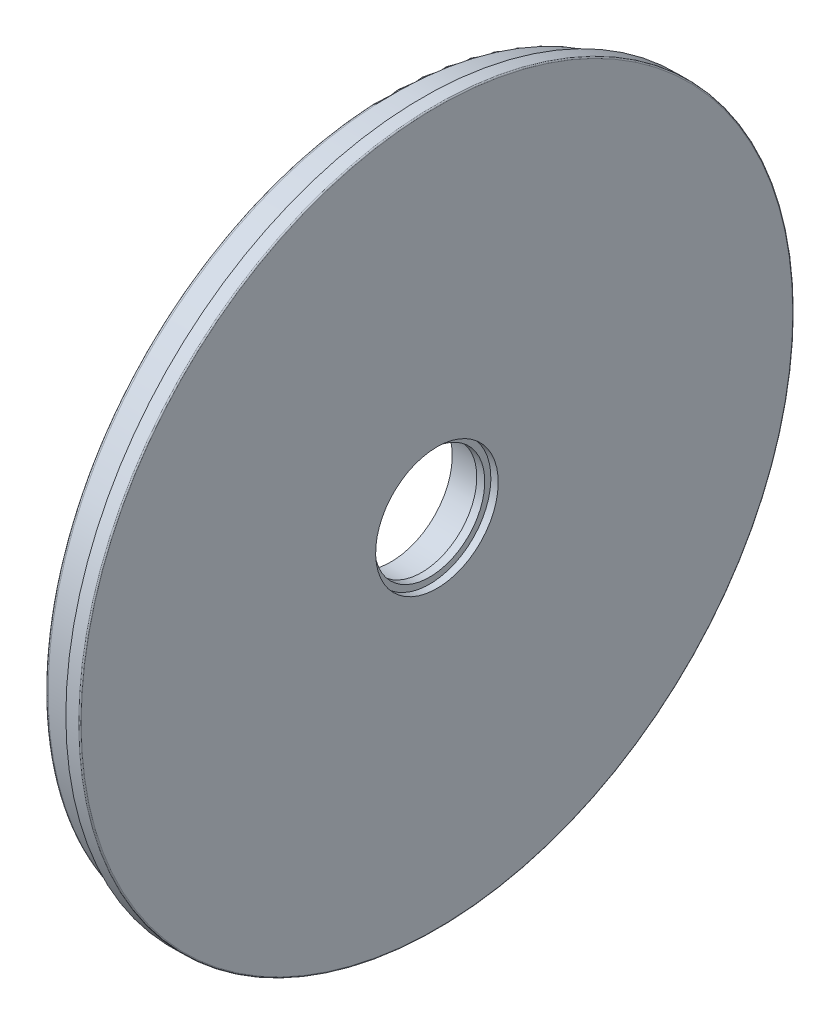
ISO-10303-21;
HEADER;
FILE_DESCRIPTION(('STEP AP214'),'2;1');
FILE_NAME('part.step','',(''),(''),'','','');
FILE_SCHEMA(('AUTOMOTIVE_DESIGN { 1 0 10303 214 1 1 1 1 }'));
ENDSEC;
DATA;
#1=APPLICATION_CONTEXT('core data for automotive mechanical design processes');
#2=APPLICATION_PROTOCOL_DEFINITION('international standard','automotive_design',2000,#1);
#3=PRODUCT_CONTEXT('',#1,'mechanical');
#4=PRODUCT('Part','Part','',(#3));
#5=PRODUCT_RELATED_PRODUCT_CATEGORY('part','',(#4));
#6=PRODUCT_DEFINITION_FORMATION('','',#4);
#7=PRODUCT_DEFINITION_CONTEXT('part definition',#1,'design');
#8=PRODUCT_DEFINITION('design','',#6,#7);
#9=PRODUCT_DEFINITION_SHAPE('','',#8);
#10=(LENGTH_UNIT() NAMED_UNIT(*) SI_UNIT(.MILLI.,.METRE.));
#11=(NAMED_UNIT(*) PLANE_ANGLE_UNIT() SI_UNIT($,.RADIAN.));
#12=(NAMED_UNIT(*) SI_UNIT($,.STERADIAN.) SOLID_ANGLE_UNIT());
#13=UNCERTAINTY_MEASURE_WITH_UNIT(LENGTH_MEASURE(1.E-05),#10,'distance_accuracy_value','');
#14=(GEOMETRIC_REPRESENTATION_CONTEXT(3) GLOBAL_UNCERTAINTY_ASSIGNED_CONTEXT((#13)) GLOBAL_UNIT_ASSIGNED_CONTEXT((#10,
#11,#12)) REPRESENTATION_CONTEXT('',''));
#15=CARTESIAN_POINT('',(0.,0.,0.));
#16=DIRECTION('',(0.,0.,1.));
#17=DIRECTION('',(1.,0.,0.));
#18=AXIS2_PLACEMENT_3D('',#15,#16,#17);
#19=CARTESIAN_POINT('',(167.134413688106,0.,0.));
#20=DIRECTION('',(-1.,0.,0.));
#21=DIRECTION('',(0.,0.,1.));
#22=AXIS2_PLACEMENT_3D('',#19,#20,#21);
#23=CYLINDRICAL_SURFACE('',#22,56.4392882147993);
#24=CARTESIAN_POINT('',(0.5,0.,0.));
#25=DIRECTION('',(1.,0.,0.));
#26=DIRECTION('',(0.,0.,-1.));
#27=AXIS2_PLACEMENT_3D('',#24,#25,#26);
#28=CIRCLE('',#27,56.4392882147993);
#29=CARTESIAN_POINT('',(0.5,0.,-56.4392882147993));
#30=VERTEX_POINT('',#29);
#31=EDGE_CURVE('E59',#30,#30,#28,.T.);
#32=ORIENTED_EDGE('',*,*,#31,.T.);
#33=EDGE_LOOP('',(#32));
#34=FACE_BOUND('',#33,.T.);
#35=CARTESIAN_POINT('',(5.19999999999998,0.,0.));
#36=DIRECTION('',(1.,0.,0.));
#37=DIRECTION('',(0.,0.,-1.));
#38=AXIS2_PLACEMENT_3D('',#35,#36,#37);
#39=CIRCLE('',#38,56.4392882147993);
#40=CARTESIAN_POINT('',(5.19999999999998,0.,-56.4392882147993));
#41=VERTEX_POINT('',#40);
#42=EDGE_CURVE('E50',#41,#41,#39,.T.);
#43=ORIENTED_EDGE('',*,*,#42,.F.);
#44=EDGE_LOOP('',(#43));
#45=FACE_BOUND('',#44,.T.);
#46=ADVANCED_FACE('F39',(#34,#45),#23,.T.);
#47=CARTESIAN_POINT('',(0.,0.,0.));
#48=DIRECTION('',(1.,0.,0.));
#49=DIRECTION('',(0.,0.,-1.));
#50=AXIS2_PLACEMENT_3D('',#47,#48,#49);
#51=PLANE('',#50);
#52=CARTESIAN_POINT('',(0.,0.,0.));
#53=DIRECTION('',(1.,0.,0.));
#54=DIRECTION('',(0.,1.,0.));
#55=AXIS2_PLACEMENT_3D('',#52,#53,#54);
#56=CIRCLE('',#55,10.);
#57=CARTESIAN_POINT('',(0.,10.,0.));
#58=VERTEX_POINT('',#57);
#59=EDGE_CURVE('E65',#58,#58,#56,.T.);
#60=ORIENTED_EDGE('',*,*,#59,.T.);
#61=EDGE_LOOP('',(#60));
#62=FACE_BOUND('',#61,.T.);
#63=CARTESIAN_POINT('',(0.,0.,0.));
#64=DIRECTION('',(1.,0.,0.));
#65=DIRECTION('',(0.,0.,-1.));
#66=AXIS2_PLACEMENT_3D('',#63,#64,#65);
#67=CIRCLE('',#66,55.9392882147993);
#68=CARTESIAN_POINT('',(0.,0.,-55.9392882147993));
#69=VERTEX_POINT('',#68);
#70=EDGE_CURVE('E54',#69,#69,#67,.F.);
#71=ORIENTED_EDGE('',*,*,#70,.T.);
#72=EDGE_LOOP('',(#71));
#73=FACE_BOUND('',#72,.T.);
#74=ADVANCED_FACE('F102',(#62,#73),#51,.F.);
#75=CARTESIAN_POINT('',(0.5,0.,0.));
#76=DIRECTION('',(1.,0.,0.));
#77=DIRECTION('',(0.,0.,-1.));
#78=AXIS2_PLACEMENT_3D('',#75,#76,#77);
#79=TOROIDAL_SURFACE('',#78,55.9392882147993,0.5);
#80=ORIENTED_EDGE('',*,*,#70,.F.);
#81=EDGE_LOOP('',(#80));
#82=FACE_BOUND('',#81,.T.);
#83=ORIENTED_EDGE('',*,*,#31,.F.);
#84=EDGE_LOOP('',(#83));
#85=FACE_BOUND('',#84,.T.);
#86=ADVANCED_FACE('F107',(#82,#85),#79,.T.);
#87=CARTESIAN_POINT('',(5.19999999999999,0.,0.));
#88=DIRECTION('',(1.,0.,0.));
#89=DIRECTION('',(0.,0.,-1.));
#90=AXIS2_PLACEMENT_3D('',#87,#88,#89);
#91=CYLINDRICAL_SURFACE('',#90,58.2382834370733);
#92=CARTESIAN_POINT('',(7.29999999999999,0.,0.));
#93=DIRECTION('',(1.,0.,0.));
#94=DIRECTION('',(0.,0.,-1.));
#95=AXIS2_PLACEMENT_3D('',#92,#93,#94);
#96=CIRCLE('',#95,58.2382834370733);
#97=CARTESIAN_POINT('',(7.29999999999999,0.,-58.2382834370733));
#98=VERTEX_POINT('',#97);
#99=EDGE_CURVE('E10',#98,#98,#96,.F.);
#100=ORIENTED_EDGE('',*,*,#99,.T.);
#101=EDGE_LOOP('',(#100));
#102=FACE_BOUND('',#101,.T.);
#103=CARTESIAN_POINT('',(5.19999999999999,0.,0.));
#104=DIRECTION('',(1.,0.,0.));
#105=DIRECTION('',(0.,0.,-1.));
#106=AXIS2_PLACEMENT_3D('',#103,#104,#105);
#107=CIRCLE('',#106,58.2382834370733);
#108=CARTESIAN_POINT('',(5.19999999999999,0.,-58.2382834370733));
#109=VERTEX_POINT('',#108);
#110=EDGE_CURVE('E62',#109,#109,#107,.T.);
#111=ORIENTED_EDGE('',*,*,#110,.T.);
#112=EDGE_LOOP('',(#111));
#113=FACE_BOUND('',#112,.T.);
#114=ADVANCED_FACE('F97',(#102,#113),#91,.T.);
#115=CARTESIAN_POINT('',(5.19999999999999,0.,0.));
#116=DIRECTION('',(1.,0.,0.));
#117=DIRECTION('',(0.,0.,-1.));
#118=AXIS2_PLACEMENT_3D('',#115,#116,#117);
#119=PLANE('',#118);
#120=ORIENTED_EDGE('',*,*,#42,.T.);
#121=EDGE_LOOP('',(#120));
#122=FACE_BOUND('',#121,.T.);
#123=ORIENTED_EDGE('',*,*,#110,.F.);
#124=EDGE_LOOP('',(#123));
#125=FACE_BOUND('',#124,.T.);
#126=ADVANCED_FACE('F89',(#122,#125),#119,.F.);
#127=CARTESIAN_POINT('',(7.49999999999999,0.,0.));
#128=DIRECTION('',(1.,0.,0.));
#129=DIRECTION('',(0.,0.,-1.));
#130=AXIS2_PLACEMENT_3D('',#127,#128,#129);
#131=PLANE('',#130);
#132=CARTESIAN_POINT('',(7.49999999999999,0.,0.));
#133=DIRECTION('',(1.,0.,0.));
#134=DIRECTION('',(0.,0.,-1.));
#135=AXIS2_PLACEMENT_3D('',#132,#133,#134);
#136=CIRCLE('',#135,58.0382834370733);
#137=CARTESIAN_POINT('',(7.49999999999999,0.,-58.0382834370733));
#138=VERTEX_POINT('',#137);
#139=EDGE_CURVE('E46',#138,#138,#136,.T.);
#140=ORIENTED_EDGE('',*,*,#139,.T.);
#141=EDGE_LOOP('',(#140));
#142=FACE_BOUND('',#141,.T.);
#143=CARTESIAN_POINT('',(7.5,0.,0.));
#144=DIRECTION('',(1.,0.,0.));
#145=DIRECTION('',(0.,1.,0.));
#146=AXIS2_PLACEMENT_3D('',#143,#144,#145);
#147=CIRCLE('',#146,10.);
#148=CARTESIAN_POINT('',(7.5,10.,0.));
#149=VERTEX_POINT('',#148);
#150=EDGE_CURVE('E80',#149,#149,#147,.T.);
#151=ORIENTED_EDGE('',*,*,#150,.F.);
#152=EDGE_LOOP('',(#151));
#153=FACE_BOUND('',#152,.T.);
#154=ADVANCED_FACE('F87',(#142,#153),#131,.T.);
#155=CARTESIAN_POINT('',(7.29999999999999,0.,0.));
#156=DIRECTION('',(1.,0.,0.));
#157=DIRECTION('',(0.,0.,-1.));
#158=AXIS2_PLACEMENT_3D('',#155,#156,#157);
#159=TOROIDAL_SURFACE('',#158,58.0382834370733,0.2);
#160=ORIENTED_EDGE('',*,*,#99,.F.);
#161=EDGE_LOOP('',(#160));
#162=FACE_BOUND('',#161,.T.);
#163=ORIENTED_EDGE('',*,*,#139,.F.);
#164=EDGE_LOOP('',(#163));
#165=FACE_BOUND('',#164,.T.);
#166=ADVANCED_FACE('F41',(#162,#165),#159,.T.);
#167=CARTESIAN_POINT('',(8.49999999999999,0.,0.));
#168=DIRECTION('',(1.,0.,0.));
#169=DIRECTION('',(0.,1.,0.));
#170=AXIS2_PLACEMENT_3D('',#167,#168,#169);
#171=CYLINDRICAL_SURFACE('',#170,10.);
#172=CARTESIAN_POINT('',(4.99999999999999,0.,0.));
#173=DIRECTION('',(1.,0.,0.));
#174=DIRECTION('',(0.,1.,0.));
#175=AXIS2_PLACEMENT_3D('',#172,#173,#174);
#176=CIRCLE('',#175,10.);
#177=CARTESIAN_POINT('',(4.99999999999999,10.,0.));
#178=VERTEX_POINT('',#177);
#179=EDGE_CURVE('E68',#178,#178,#176,.T.);
#180=ORIENTED_EDGE('',*,*,#179,.T.);
#181=EDGE_LOOP('',(#180));
#182=FACE_BOUND('',#181,.T.);
#183=ORIENTED_EDGE('',*,*,#59,.F.);
#184=EDGE_LOOP('',(#183));
#185=FACE_BOUND('',#184,.T.);
#186=ADVANCED_FACE('F95',(#182,#185),#171,.F.);
#187=CARTESIAN_POINT('',(4.99999999999998,1.38777878078136E-13,0.));
#188=DIRECTION('',(-1.,0.,0.));
#189=DIRECTION('',(0.,-1.,0.));
#190=AXIS2_PLACEMENT_3D('',#187,#188,#189);
#191=PLANE('',#190);
#192=CARTESIAN_POINT('',(4.99999999999996,0.,0.));
#193=DIRECTION('',(1.,0.,0.));
#194=DIRECTION('',(0.,1.,0.));
#195=AXIS2_PLACEMENT_3D('',#192,#193,#194);
#196=CIRCLE('',#195,9.);
#197=CARTESIAN_POINT('',(4.99999999999996,9.,0.));
#198=VERTEX_POINT('',#197);
#199=EDGE_CURVE('E71',#198,#198,#196,.T.);
#200=ORIENTED_EDGE('',*,*,#199,.T.);
#201=EDGE_LOOP('',(#200));
#202=FACE_BOUND('',#201,.T.);
#203=ORIENTED_EDGE('',*,*,#179,.F.);
#204=EDGE_LOOP('',(#203));
#205=FACE_BOUND('',#204,.T.);
#206=ADVANCED_FACE('F116',(#202,#205),#191,.T.);
#207=CARTESIAN_POINT('',(8.49999999999999,0.,0.));
#208=DIRECTION('',(1.,0.,0.));
#209=DIRECTION('',(0.,1.,0.));
#210=AXIS2_PLACEMENT_3D('',#207,#208,#209);
#211=CYLINDRICAL_SURFACE('',#210,9.);
#212=CARTESIAN_POINT('',(6.29999999999997,0.,0.));
#213=DIRECTION('',(1.,0.,0.));
#214=DIRECTION('',(0.,1.,0.));
#215=AXIS2_PLACEMENT_3D('',#212,#213,#214);
#216=CIRCLE('',#215,9.);
#217=CARTESIAN_POINT('',(6.29999999999997,9.,0.));
#218=VERTEX_POINT('',#217);
#219=EDGE_CURVE('E74',#218,#218,#216,.T.);
#220=ORIENTED_EDGE('',*,*,#219,.T.);
#221=EDGE_LOOP('',(#220));
#222=FACE_BOUND('',#221,.T.);
#223=ORIENTED_EDGE('',*,*,#199,.F.);
#224=EDGE_LOOP('',(#223));
#225=FACE_BOUND('',#224,.T.);
#226=ADVANCED_FACE('F120',(#222,#225),#211,.F.);
#227=CARTESIAN_POINT('',(6.29999999999998,1.63931368479801E-13,0.));
#228=DIRECTION('',(1.,0.,0.));
#229=DIRECTION('',(0.,1.,0.));
#230=AXIS2_PLACEMENT_3D('',#227,#228,#229);
#231=PLANE('',#230);
#232=CARTESIAN_POINT('',(6.29999999999999,0.,0.));
#233=DIRECTION('',(1.,0.,0.));
#234=DIRECTION('',(0.,1.,0.));
#235=AXIS2_PLACEMENT_3D('',#232,#233,#234);
#236=CIRCLE('',#235,10.);
#237=CARTESIAN_POINT('',(6.29999999999999,10.,0.));
#238=VERTEX_POINT('',#237);
#239=EDGE_CURVE('E77',#238,#238,#236,.T.);
#240=ORIENTED_EDGE('',*,*,#239,.T.);
#241=EDGE_LOOP('',(#240));
#242=FACE_BOUND('',#241,.T.);
#243=ORIENTED_EDGE('',*,*,#219,.F.);
#244=EDGE_LOOP('',(#243));
#245=FACE_BOUND('',#244,.T.);
#246=ADVANCED_FACE('F124',(#242,#245),#231,.T.);
#247=CARTESIAN_POINT('',(8.49999999999999,0.,0.));
#248=DIRECTION('',(1.,0.,0.));
#249=DIRECTION('',(0.,1.,0.));
#250=AXIS2_PLACEMENT_3D('',#247,#248,#249);
#251=CYLINDRICAL_SURFACE('',#250,10.);
#252=ORIENTED_EDGE('',*,*,#150,.T.);
#253=EDGE_LOOP('',(#252));
#254=FACE_BOUND('',#253,.T.);
#255=ORIENTED_EDGE('',*,*,#239,.F.);
#256=EDGE_LOOP('',(#255));
#257=FACE_BOUND('',#256,.T.);
#258=ADVANCED_FACE('F84',(#254,#257),#251,.F.);
#259=CLOSED_SHELL('',(#46,#74,#86,#114,#126,#154,#166,#186,#206,#226,#246,#258));
#260=MANIFOLD_SOLID_BREP('B2',#259);
#261=ADVANCED_BREP_SHAPE_REPRESENTATION('',(#18,#260),#14);
#262=SHAPE_DEFINITION_REPRESENTATION(#9,#261);
ENDSEC;
END-ISO-10303-21;
